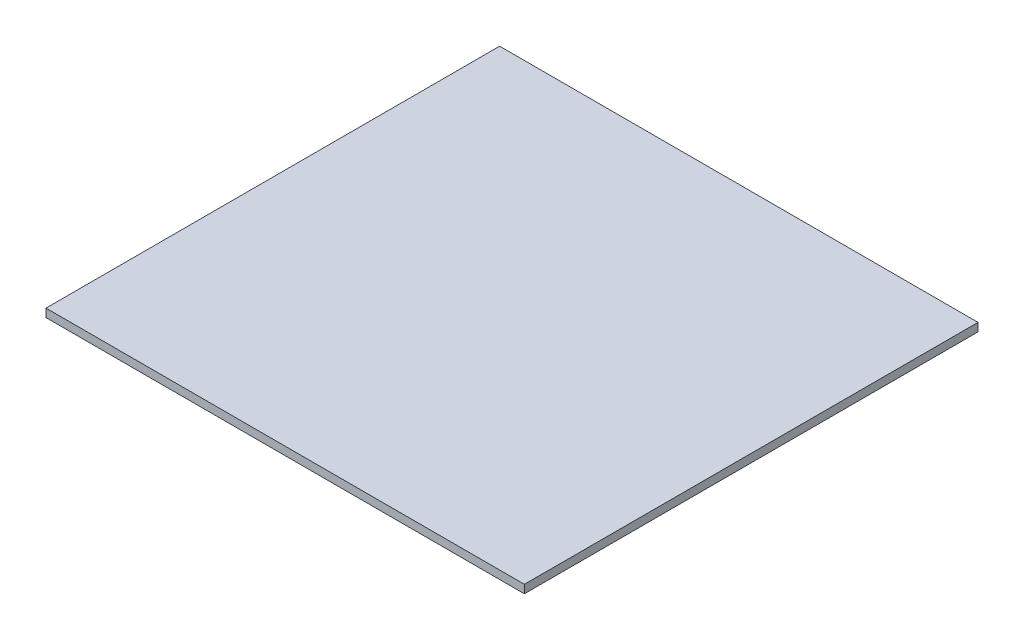
ISO-10303-21;
HEADER;
FILE_DESCRIPTION(('STEP AP214'),'2;1');
FILE_NAME('part.step','',(''),(''),'','','');
FILE_SCHEMA(('AUTOMOTIVE_DESIGN { 1 0 10303 214 1 1 1 1 }'));
ENDSEC;
DATA;
#1=APPLICATION_CONTEXT('core data for automotive mechanical design processes');
#2=APPLICATION_PROTOCOL_DEFINITION('international standard','automotive_design',2000,#1);
#3=PRODUCT_CONTEXT('',#1,'mechanical');
#4=PRODUCT('Part','Part','',(#3));
#5=PRODUCT_RELATED_PRODUCT_CATEGORY('part','',(#4));
#6=PRODUCT_DEFINITION_FORMATION('','',#4);
#7=PRODUCT_DEFINITION_CONTEXT('part definition',#1,'design');
#8=PRODUCT_DEFINITION('design','',#6,#7);
#9=PRODUCT_DEFINITION_SHAPE('','',#8);
#10=(LENGTH_UNIT() NAMED_UNIT(*) SI_UNIT(.MILLI.,.METRE.));
#11=(NAMED_UNIT(*) PLANE_ANGLE_UNIT() SI_UNIT($,.RADIAN.));
#12=(NAMED_UNIT(*) SI_UNIT($,.STERADIAN.) SOLID_ANGLE_UNIT());
#13=UNCERTAINTY_MEASURE_WITH_UNIT(LENGTH_MEASURE(1.E-05),#10,'distance_accuracy_value','');
#14=(GEOMETRIC_REPRESENTATION_CONTEXT(3) GLOBAL_UNCERTAINTY_ASSIGNED_CONTEXT((#13)) GLOBAL_UNIT_ASSIGNED_CONTEXT((#10,
#11,#12)) REPRESENTATION_CONTEXT('',''));
#15=CARTESIAN_POINT('',(0.,0.,0.));
#16=DIRECTION('',(0.,0.,1.));
#17=DIRECTION('',(1.,0.,0.));
#18=AXIS2_PLACEMENT_3D('',#15,#16,#17);
#19=CARTESIAN_POINT('',(60.,330.,-580.));
#20=DIRECTION('',(-1.,0.,0.));
#21=DIRECTION('',(0.,0.,1.));
#22=AXIS2_PLACEMENT_3D('',#19,#20,#21);
#23=PLANE('',#22);
#24=DIRECTION('',(0.,-1.,0.));
#25=VECTOR('',#24,1.);
#26=CARTESIAN_POINT('',(60.,330.,-30.));
#27=LINE('',#26,#25);
#28=CARTESIAN_POINT('',(60.,340.,-30.));
#29=VERTEX_POINT('',#28);
#30=CARTESIAN_POINT('',(60.,330.,-30.));
#31=VERTEX_POINT('',#30);
#32=EDGE_CURVE('E103',#29,#31,#27,.T.);
#33=ORIENTED_EDGE('',*,*,#32,.F.);
#34=DIRECTION('',(0.,0.,1.));
#35=VECTOR('',#34,1.);
#36=CARTESIAN_POINT('',(60.,340.,-580.));
#37=LINE('',#36,#35);
#38=CARTESIAN_POINT('',(60.,340.,-580.));
#39=VERTEX_POINT('',#38);
#40=EDGE_CURVE('E11',#39,#29,#37,.T.);
#41=ORIENTED_EDGE('',*,*,#40,.F.);
#42=DIRECTION('',(0.,-1.,0.));
#43=VECTOR('',#42,1.);
#44=CARTESIAN_POINT('',(60.,330.,-580.));
#45=LINE('',#44,#43);
#46=CARTESIAN_POINT('',(60.,330.,-580.));
#47=VERTEX_POINT('',#46);
#48=EDGE_CURVE('E97',#39,#47,#45,.T.);
#49=ORIENTED_EDGE('',*,*,#48,.T.);
#50=DIRECTION('',(0.,0.,1.));
#51=VECTOR('',#50,1.);
#52=CARTESIAN_POINT('',(60.,330.,-580.));
#53=LINE('',#52,#51);
#54=EDGE_CURVE('E42',#47,#31,#53,.T.);
#55=ORIENTED_EDGE('',*,*,#54,.T.);
#56=EDGE_LOOP('',(#33,#41,#49,#55));
#57=FACE_BOUND('',#56,.T.);
#58=ADVANCED_FACE('F39',(#57),#23,.T.);
#59=CARTESIAN_POINT('',(60.,340.,-580.));
#60=DIRECTION('',(0.,1.,0.));
#61=DIRECTION('',(0.,0.,1.));
#62=AXIS2_PLACEMENT_3D('',#59,#60,#61);
#63=PLANE('',#62);
#64=DIRECTION('',(-1.,0.,0.));
#65=VECTOR('',#64,1.);
#66=CARTESIAN_POINT('',(60.,340.,-30.));
#67=LINE('',#66,#65);
#68=CARTESIAN_POINT('',(640.,340.,-30.));
#69=VERTEX_POINT('',#68);
#70=EDGE_CURVE('E99',#69,#29,#67,.T.);
#71=ORIENTED_EDGE('',*,*,#70,.F.);
#72=DIRECTION('',(0.,0.,1.));
#73=VECTOR('',#72,1.);
#74=CARTESIAN_POINT('',(640.,340.,-580.));
#75=LINE('',#74,#73);
#76=CARTESIAN_POINT('',(640.,340.,-580.));
#77=VERTEX_POINT('',#76);
#78=EDGE_CURVE('E48',#77,#69,#75,.T.);
#79=ORIENTED_EDGE('',*,*,#78,.F.);
#80=DIRECTION('',(-1.,0.,0.));
#81=VECTOR('',#80,1.);
#82=CARTESIAN_POINT('',(60.,340.,-580.));
#83=LINE('',#82,#81);
#84=EDGE_CURVE('E94',#77,#39,#83,.T.);
#85=ORIENTED_EDGE('',*,*,#84,.T.);
#86=ORIENTED_EDGE('',*,*,#40,.T.);
#87=EDGE_LOOP('',(#71,#79,#85,#86));
#88=FACE_BOUND('',#87,.T.);
#89=ADVANCED_FACE('F113',(#88),#63,.T.);
#90=CARTESIAN_POINT('',(640.,330.,-580.));
#91=DIRECTION('',(1.,0.,0.));
#92=DIRECTION('',(0.,0.,-1.));
#93=AXIS2_PLACEMENT_3D('',#90,#91,#92);
#94=PLANE('',#93);
#95=DIRECTION('',(0.,1.,0.));
#96=VECTOR('',#95,1.);
#97=CARTESIAN_POINT('',(640.,330.,-30.));
#98=LINE('',#97,#96);
#99=CARTESIAN_POINT('',(640.,330.,-30.));
#100=VERTEX_POINT('',#99);
#101=EDGE_CURVE('E89',#100,#69,#98,.T.);
#102=ORIENTED_EDGE('',*,*,#101,.F.);
#103=DIRECTION('',(0.,0.,1.));
#104=VECTOR('',#103,1.);
#105=CARTESIAN_POINT('',(640.,330.,-580.));
#106=LINE('',#105,#104);
#107=CARTESIAN_POINT('',(640.,330.,-580.));
#108=VERTEX_POINT('',#107);
#109=EDGE_CURVE('E84',#108,#100,#106,.T.);
#110=ORIENTED_EDGE('',*,*,#109,.F.);
#111=DIRECTION('',(0.,1.,0.));
#112=VECTOR('',#111,1.);
#113=CARTESIAN_POINT('',(640.,330.,-580.));
#114=LINE('',#113,#112);
#115=EDGE_CURVE('E87',#108,#77,#114,.T.);
#116=ORIENTED_EDGE('',*,*,#115,.T.);
#117=ORIENTED_EDGE('',*,*,#78,.T.);
#118=EDGE_LOOP('',(#102,#110,#116,#117));
#119=FACE_BOUND('',#118,.T.);
#120=ADVANCED_FACE('F86',(#119),#94,.T.);
#121=CARTESIAN_POINT('',(60.,330.,-580.));
#122=DIRECTION('',(0.,-1.,0.));
#123=DIRECTION('',(0.,0.,-1.));
#124=AXIS2_PLACEMENT_3D('',#121,#122,#123);
#125=PLANE('',#124);
#126=DIRECTION('',(1.,0.,0.));
#127=VECTOR('',#126,1.);
#128=CARTESIAN_POINT('',(60.,330.,-30.));
#129=LINE('',#128,#127);
#130=EDGE_CURVE('E106',#31,#100,#129,.T.);
#131=ORIENTED_EDGE('',*,*,#130,.F.);
#132=ORIENTED_EDGE('',*,*,#54,.F.);
#133=DIRECTION('',(1.,0.,0.));
#134=VECTOR('',#133,1.);
#135=CARTESIAN_POINT('',(60.,330.,-580.));
#136=LINE('',#135,#134);
#137=EDGE_CURVE('E93',#47,#108,#136,.T.);
#138=ORIENTED_EDGE('',*,*,#137,.T.);
#139=ORIENTED_EDGE('',*,*,#109,.T.);
#140=EDGE_LOOP('',(#131,#132,#138,#139));
#141=FACE_BOUND('',#140,.T.);
#142=ADVANCED_FACE('F96',(#141),#125,.T.);
#143=CARTESIAN_POINT('',(0.,0.,-580.));
#144=DIRECTION('',(0.,0.,-1.));
#145=DIRECTION('',(-1.,0.,0.));
#146=AXIS2_PLACEMENT_3D('',#143,#144,#145);
#147=PLANE('',#146);
#148=ORIENTED_EDGE('',*,*,#48,.F.);
#149=ORIENTED_EDGE('',*,*,#84,.F.);
#150=ORIENTED_EDGE('',*,*,#115,.F.);
#151=ORIENTED_EDGE('',*,*,#137,.F.);
#152=EDGE_LOOP('',(#148,#149,#150,#151));
#153=FACE_BOUND('',#152,.T.);
#154=ADVANCED_FACE('F92',(#153),#147,.T.);
#155=CARTESIAN_POINT('',(0.,0.,-30.));
#156=DIRECTION('',(0.,0.,-1.));
#157=DIRECTION('',(-1.,0.,0.));
#158=AXIS2_PLACEMENT_3D('',#155,#156,#157);
#159=PLANE('',#158);
#160=ORIENTED_EDGE('',*,*,#32,.T.);
#161=ORIENTED_EDGE('',*,*,#130,.T.);
#162=ORIENTED_EDGE('',*,*,#101,.T.);
#163=ORIENTED_EDGE('',*,*,#70,.T.);
#164=EDGE_LOOP('',(#160,#161,#162,#163));
#165=FACE_BOUND('',#164,.T.);
#166=ADVANCED_FACE('F112',(#165),#159,.F.);
#167=CLOSED_SHELL('',(#58,#89,#120,#142,#154,#166));
#168=MANIFOLD_SOLID_BREP('B2',#167);
#169=ADVANCED_BREP_SHAPE_REPRESENTATION('',(#18,#168),#14);
#170=SHAPE_DEFINITION_REPRESENTATION(#9,#169);
ENDSEC;
END-ISO-10303-21;
